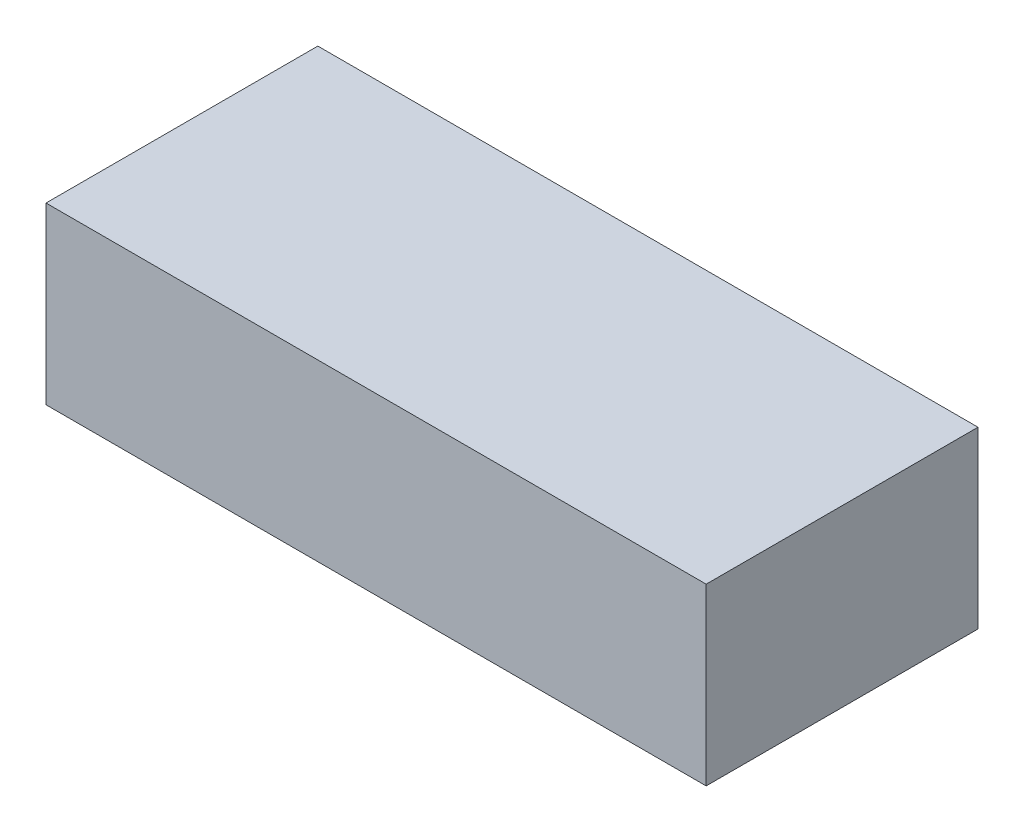
ISO-10303-21;
HEADER;
FILE_DESCRIPTION(('STEP AP214'),'2;1');
FILE_NAME('part.step','',(''),(''),'','','');
FILE_SCHEMA(('AUTOMOTIVE_DESIGN { 1 0 10303 214 1 1 1 1 }'));
ENDSEC;
DATA;
#1=APPLICATION_CONTEXT('core data for automotive mechanical design processes');
#2=APPLICATION_PROTOCOL_DEFINITION('international standard','automotive_design',2000,#1);
#3=PRODUCT_CONTEXT('',#1,'mechanical');
#4=PRODUCT('Part','Part','',(#3));
#5=PRODUCT_RELATED_PRODUCT_CATEGORY('part','',(#4));
#6=PRODUCT_DEFINITION_FORMATION('','',#4);
#7=PRODUCT_DEFINITION_CONTEXT('part definition',#1,'design');
#8=PRODUCT_DEFINITION('design','',#6,#7);
#9=PRODUCT_DEFINITION_SHAPE('','',#8);
#10=(LENGTH_UNIT() NAMED_UNIT(*) SI_UNIT(.MILLI.,.METRE.));
#11=(NAMED_UNIT(*) PLANE_ANGLE_UNIT() SI_UNIT($,.RADIAN.));
#12=(NAMED_UNIT(*) SI_UNIT($,.STERADIAN.) SOLID_ANGLE_UNIT());
#13=UNCERTAINTY_MEASURE_WITH_UNIT(LENGTH_MEASURE(1.E-05),#10,'distance_accuracy_value','');
#14=(GEOMETRIC_REPRESENTATION_CONTEXT(3) GLOBAL_UNCERTAINTY_ASSIGNED_CONTEXT((#13)) GLOBAL_UNIT_ASSIGNED_CONTEXT((#10,
#11,#12)) REPRESENTATION_CONTEXT('',''));
#15=CARTESIAN_POINT('',(0.,0.,0.));
#16=DIRECTION('',(0.,0.,1.));
#17=DIRECTION('',(1.,0.,0.));
#18=AXIS2_PLACEMENT_3D('',#15,#16,#17);
#19=CARTESIAN_POINT('',(-85.,22.5,35.));
#20=DIRECTION('',(1.,0.,0.));
#21=DIRECTION('',(0.,0.,-1.));
#22=AXIS2_PLACEMENT_3D('',#19,#20,#21);
#23=PLANE('',#22);
#24=DIRECTION('',(0.,0.,1.));
#25=VECTOR('',#24,1.);
#26=CARTESIAN_POINT('',(-85.,-22.5,35.));
#27=LINE('',#26,#25);
#28=CARTESIAN_POINT('',(-85.,-22.5,-35.));
#29=VERTEX_POINT('',#28);
#30=CARTESIAN_POINT('',(-85.,-22.5,35.));
#31=VERTEX_POINT('',#30);
#32=EDGE_CURVE('E102',#29,#31,#27,.T.);
#33=ORIENTED_EDGE('',*,*,#32,.T.);
#34=DIRECTION('',(0.,-1.,0.));
#35=VECTOR('',#34,1.);
#36=CARTESIAN_POINT('',(-85.,22.5,35.));
#37=LINE('',#36,#35);
#38=CARTESIAN_POINT('',(-85.,22.5,35.));
#39=VERTEX_POINT('',#38);
#40=EDGE_CURVE('E11',#39,#31,#37,.T.);
#41=ORIENTED_EDGE('',*,*,#40,.F.);
#42=DIRECTION('',(0.,0.,1.));
#43=VECTOR('',#42,1.);
#44=CARTESIAN_POINT('',(-85.,22.5,35.));
#45=LINE('',#44,#43);
#46=CARTESIAN_POINT('',(-85.,22.5,-35.));
#47=VERTEX_POINT('',#46);
#48=EDGE_CURVE('E90',#47,#39,#45,.T.);
#49=ORIENTED_EDGE('',*,*,#48,.F.);
#50=DIRECTION('',(0.,-1.,0.));
#51=VECTOR('',#50,1.);
#52=CARTESIAN_POINT('',(-85.,22.5,-35.));
#53=LINE('',#52,#51);
#54=EDGE_CURVE('E98',#47,#29,#53,.T.);
#55=ORIENTED_EDGE('',*,*,#54,.T.);
#56=EDGE_LOOP('',(#33,#41,#49,#55));
#57=FACE_BOUND('',#56,.T.);
#58=ADVANCED_FACE('F39',(#57),#23,.F.);
#59=CARTESIAN_POINT('',(85.,22.5,35.));
#60=DIRECTION('',(0.,0.,-1.));
#61=DIRECTION('',(-1.,0.,0.));
#62=AXIS2_PLACEMENT_3D('',#59,#60,#61);
#63=PLANE('',#62);
#64=DIRECTION('',(1.,0.,0.));
#65=VECTOR('',#64,1.);
#66=CARTESIAN_POINT('',(85.,-22.5,35.));
#67=LINE('',#66,#65);
#68=CARTESIAN_POINT('',(85.,-22.5,35.));
#69=VERTEX_POINT('',#68);
#70=EDGE_CURVE('E94',#31,#69,#67,.T.);
#71=ORIENTED_EDGE('',*,*,#70,.T.);
#72=DIRECTION('',(0.,-1.,0.));
#73=VECTOR('',#72,1.);
#74=CARTESIAN_POINT('',(85.,22.5,35.));
#75=LINE('',#74,#73);
#76=CARTESIAN_POINT('',(85.,22.5,35.));
#77=VERTEX_POINT('',#76);
#78=EDGE_CURVE('E47',#77,#69,#75,.T.);
#79=ORIENTED_EDGE('',*,*,#78,.F.);
#80=DIRECTION('',(1.,0.,0.));
#81=VECTOR('',#80,1.);
#82=CARTESIAN_POINT('',(85.,22.5,35.));
#83=LINE('',#82,#81);
#84=EDGE_CURVE('E85',#39,#77,#83,.T.);
#85=ORIENTED_EDGE('',*,*,#84,.F.);
#86=ORIENTED_EDGE('',*,*,#40,.T.);
#87=EDGE_LOOP('',(#71,#79,#85,#86));
#88=FACE_BOUND('',#87,.T.);
#89=ADVANCED_FACE('F93',(#88),#63,.F.);
#90=CARTESIAN_POINT('',(85.,22.5,-35.));
#91=DIRECTION('',(-1.,0.,0.));
#92=DIRECTION('',(0.,0.,1.));
#93=AXIS2_PLACEMENT_3D('',#90,#91,#92);
#94=PLANE('',#93);
#95=DIRECTION('',(0.,0.,-1.));
#96=VECTOR('',#95,1.);
#97=CARTESIAN_POINT('',(85.,-22.5,-35.));
#98=LINE('',#97,#96);
#99=CARTESIAN_POINT('',(85.,-22.5,-35.));
#100=VERTEX_POINT('',#99);
#101=EDGE_CURVE('E72',#69,#100,#98,.T.);
#102=ORIENTED_EDGE('',*,*,#101,.T.);
#103=DIRECTION('',(0.,-1.,0.));
#104=VECTOR('',#103,1.);
#105=CARTESIAN_POINT('',(85.,22.5,-35.));
#106=LINE('',#105,#104);
#107=CARTESIAN_POINT('',(85.,22.5,-35.));
#108=VERTEX_POINT('',#107);
#109=EDGE_CURVE('E95',#108,#100,#106,.T.);
#110=ORIENTED_EDGE('',*,*,#109,.F.);
#111=DIRECTION('',(0.,0.,-1.));
#112=VECTOR('',#111,1.);
#113=CARTESIAN_POINT('',(85.,22.5,-35.));
#114=LINE('',#113,#112);
#115=EDGE_CURVE('E88',#77,#108,#114,.T.);
#116=ORIENTED_EDGE('',*,*,#115,.F.);
#117=ORIENTED_EDGE('',*,*,#78,.T.);
#118=EDGE_LOOP('',(#102,#110,#116,#117));
#119=FACE_BOUND('',#118,.T.);
#120=ADVANCED_FACE('F96',(#119),#94,.F.);
#121=CARTESIAN_POINT('',(-85.,22.5,-35.));
#122=DIRECTION('',(0.,0.,1.));
#123=DIRECTION('',(1.,0.,0.));
#124=AXIS2_PLACEMENT_3D('',#121,#122,#123);
#125=PLANE('',#124);
#126=DIRECTION('',(-1.,0.,0.));
#127=VECTOR('',#126,1.);
#128=CARTESIAN_POINT('',(-85.,-22.5,-35.));
#129=LINE('',#128,#127);
#130=EDGE_CURVE('E78',#100,#29,#129,.T.);
#131=ORIENTED_EDGE('',*,*,#130,.T.);
#132=ORIENTED_EDGE('',*,*,#54,.F.);
#133=DIRECTION('',(-1.,0.,0.));
#134=VECTOR('',#133,1.);
#135=CARTESIAN_POINT('',(-85.,22.5,-35.));
#136=LINE('',#135,#134);
#137=EDGE_CURVE('E55',#108,#47,#136,.T.);
#138=ORIENTED_EDGE('',*,*,#137,.F.);
#139=ORIENTED_EDGE('',*,*,#109,.T.);
#140=EDGE_LOOP('',(#131,#132,#138,#139));
#141=FACE_BOUND('',#140,.T.);
#142=ADVANCED_FACE('F109',(#141),#125,.F.);
#143=CARTESIAN_POINT('',(0.,22.5,0.));
#144=DIRECTION('',(0.,-1.,0.));
#145=DIRECTION('',(0.,0.,-1.));
#146=AXIS2_PLACEMENT_3D('',#143,#144,#145);
#147=PLANE('',#146);
#148=ORIENTED_EDGE('',*,*,#48,.T.);
#149=ORIENTED_EDGE('',*,*,#84,.T.);
#150=ORIENTED_EDGE('',*,*,#115,.T.);
#151=ORIENTED_EDGE('',*,*,#137,.T.);
#152=EDGE_LOOP('',(#148,#149,#150,#151));
#153=FACE_BOUND('',#152,.T.);
#154=ADVANCED_FACE('F86',(#153),#147,.F.);
#155=CARTESIAN_POINT('',(0.,-22.5,0.));
#156=DIRECTION('',(0.,-1.,0.));
#157=DIRECTION('',(0.,0.,-1.));
#158=AXIS2_PLACEMENT_3D('',#155,#156,#157);
#159=PLANE('',#158);
#160=ORIENTED_EDGE('',*,*,#32,.F.);
#161=ORIENTED_EDGE('',*,*,#130,.F.);
#162=ORIENTED_EDGE('',*,*,#101,.F.);
#163=ORIENTED_EDGE('',*,*,#70,.F.);
#164=EDGE_LOOP('',(#160,#161,#162,#163));
#165=FACE_BOUND('',#164,.T.);
#166=ADVANCED_FACE('F112',(#165),#159,.T.);
#167=CLOSED_SHELL('',(#58,#89,#120,#142,#154,#166));
#168=MANIFOLD_SOLID_BREP('B2',#167);
#169=ADVANCED_BREP_SHAPE_REPRESENTATION('',(#18,#168),#14);
#170=SHAPE_DEFINITION_REPRESENTATION(#9,#169);
ENDSEC;
END-ISO-10303-21;
